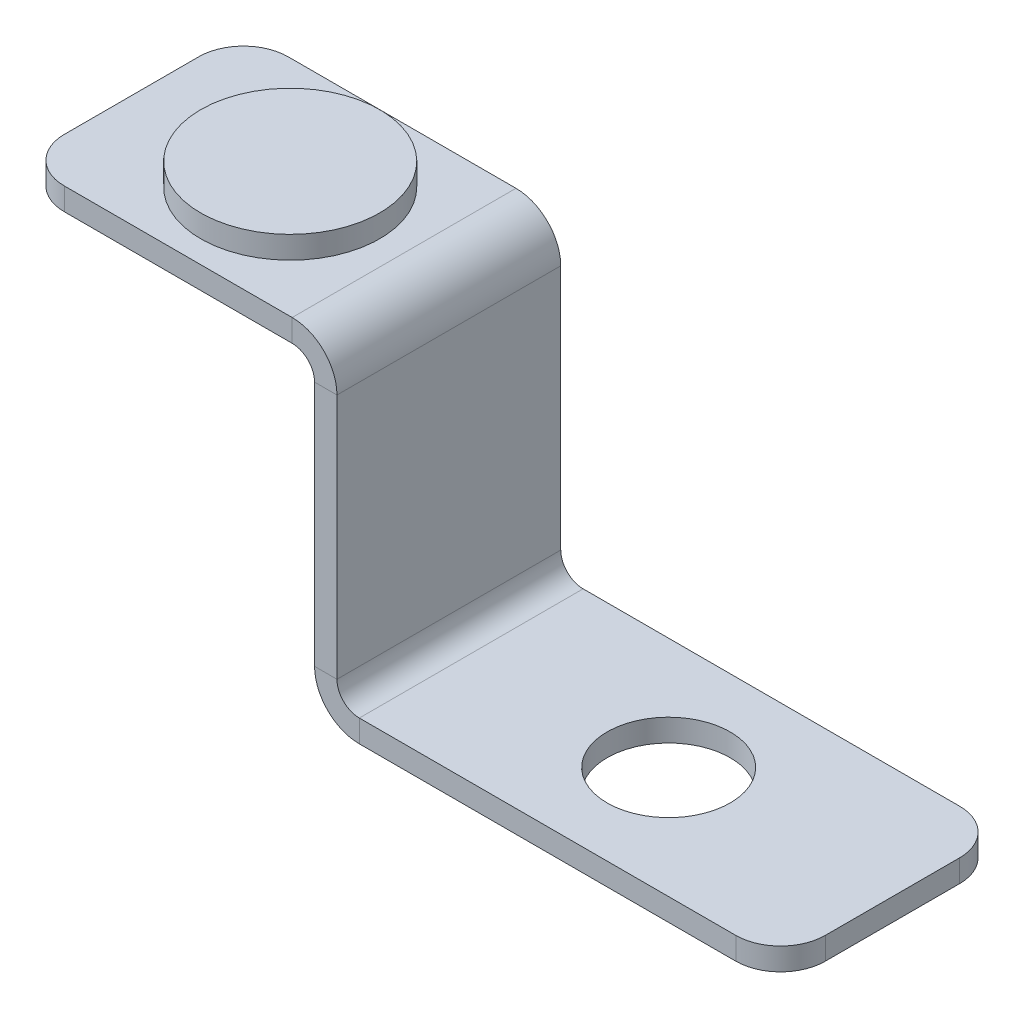
ISO-10303-21;
HEADER;
FILE_DESCRIPTION(('STEP AP214'),'2;1');
FILE_NAME('part.step','',(''),(''),'','','');
FILE_SCHEMA(('AUTOMOTIVE_DESIGN { 1 0 10303 214 1 1 1 1 }'));
ENDSEC;
DATA;
#1=APPLICATION_CONTEXT('core data for automotive mechanical design processes');
#2=APPLICATION_PROTOCOL_DEFINITION('international standard','automotive_design',2000,#1);
#3=PRODUCT_CONTEXT('',#1,'mechanical');
#4=PRODUCT('Part','Part','',(#3));
#5=PRODUCT_RELATED_PRODUCT_CATEGORY('part','',(#4));
#6=PRODUCT_DEFINITION_FORMATION('','',#4);
#7=PRODUCT_DEFINITION_CONTEXT('part definition',#1,'design');
#8=PRODUCT_DEFINITION('design','',#6,#7);
#9=PRODUCT_DEFINITION_SHAPE('','',#8);
#10=(LENGTH_UNIT() NAMED_UNIT(*) SI_UNIT(.MILLI.,.METRE.));
#11=(NAMED_UNIT(*) PLANE_ANGLE_UNIT() SI_UNIT($,.RADIAN.));
#12=(NAMED_UNIT(*) SI_UNIT($,.STERADIAN.) SOLID_ANGLE_UNIT());
#13=UNCERTAINTY_MEASURE_WITH_UNIT(LENGTH_MEASURE(1.E-05),#10,'distance_accuracy_value','');
#14=(GEOMETRIC_REPRESENTATION_CONTEXT(3) GLOBAL_UNCERTAINTY_ASSIGNED_CONTEXT((#13)) GLOBAL_UNIT_ASSIGNED_CONTEXT((#10,
#11,#12)) REPRESENTATION_CONTEXT('',''));
#15=CARTESIAN_POINT('',(0.,0.,0.));
#16=DIRECTION('',(0.,0.,1.));
#17=DIRECTION('',(1.,0.,0.));
#18=AXIS2_PLACEMENT_3D('',#15,#16,#17);
#19=CARTESIAN_POINT('',(7.08904862254812,15.,-5.));
#20=DIRECTION('',(0.,-1.,0.));
#21=DIRECTION('',(1.,0.,0.));
#22=AXIS2_PLACEMENT_3D('',#19,#20,#21);
#23=CYLINDRICAL_SURFACE('',#22,4.);
#24=CARTESIAN_POINT('',(7.08904862254812,15.,-5.));
#25=DIRECTION('',(0.,1.,0.));
#26=DIRECTION('',(-1.,0.,0.));
#27=AXIS2_PLACEMENT_3D('',#24,#25,#26);
#28=CIRCLE('',#27,4.);
#29=CARTESIAN_POINT('',(3.08904862254812,15.,-5.));
#30=VERTEX_POINT('',#29);
#31=EDGE_CURVE('E12',#30,#30,#28,.T.);
#32=ORIENTED_EDGE('',*,*,#31,.F.);
#33=EDGE_LOOP('',(#32));
#34=FACE_BOUND('',#33,.T.);
#35=CARTESIAN_POINT('',(7.08904862254812,14.,-5.));
#36=DIRECTION('',(0.,1.,0.));
#37=DIRECTION('',(-1.,0.,0.));
#38=AXIS2_PLACEMENT_3D('',#35,#36,#37);
#39=CIRCLE('',#38,4.);
#40=CARTESIAN_POINT('',(3.08904862254812,14.,-5.));
#41=VERTEX_POINT('',#40);
#42=EDGE_CURVE('E57',#41,#41,#39,.T.);
#43=ORIENTED_EDGE('',*,*,#42,.T.);
#44=EDGE_LOOP('',(#43));
#45=FACE_BOUND('',#44,.T.);
#46=ADVANCED_FACE('F54',(#34,#45),#23,.T.);
#47=CARTESIAN_POINT('',(7.08904862254812,15.,-5.));
#48=DIRECTION('',(0.,1.,0.));
#49=DIRECTION('',(-1.,0.,0.));
#50=AXIS2_PLACEMENT_3D('',#47,#48,#49);
#51=PLANE('',#50);
#52=ORIENTED_EDGE('',*,*,#31,.T.);
#53=EDGE_LOOP('',(#52));
#54=FACE_BOUND('',#53,.T.);
#55=ADVANCED_FACE('F69',(#54),#51,.T.);
#56=CARTESIAN_POINT('',(7.08904862254812,14.,-5.));
#57=DIRECTION('',(0.,1.,0.));
#58=DIRECTION('',(-1.,0.,0.));
#59=AXIS2_PLACEMENT_3D('',#56,#57,#58);
#60=PLANE('',#59);
#61=ORIENTED_EDGE('',*,*,#42,.F.);
#62=EDGE_LOOP('',(#61));
#63=FACE_BOUND('',#62,.T.);
#64=ADVANCED_FACE('F67',(#63),#60,.F.);
#65=CLOSED_SHELL('',(#46,#55,#64));
#66=MANIFOLD_SOLID_BREP('B2',#65);
#67=CARTESIAN_POINT('',(14.1780972450961,-18.1780972450962,-8.));
#68=DIRECTION('',(-1.,0.,0.));
#69=DIRECTION('',(0.,0.,-1.));
#70=AXIS2_PLACEMENT_3D('',#67,#68,#69);
#71=PLANE('',#70);
#72=DIRECTION('',(0.,1.,0.));
#73=VECTOR('',#72,1.);
#74=CARTESIAN_POINT('',(14.1780972450962,11.8219027549038,-10.));
#75=LINE('',#74,#73);
#76=CARTESIAN_POINT('',(14.1780972450962,1.,-10.));
#77=VERTEX_POINT('',#76);
#78=CARTESIAN_POINT('',(14.1780972450962,12.,-10.));
#79=VERTEX_POINT('',#78);
#80=EDGE_CURVE('E111',#77,#79,#75,.T.);
#81=ORIENTED_EDGE('',*,*,#80,.T.);
#82=DIRECTION('',(0.,0.,1.));
#83=VECTOR('',#82,1.);
#84=CARTESIAN_POINT('',(14.1780972450962,12.,-8.));
#85=LINE('',#84,#83);
#86=CARTESIAN_POINT('',(14.1780972450962,12.,0.));
#87=VERTEX_POINT('',#86);
#88=EDGE_CURVE('E103',#79,#87,#85,.T.);
#89=ORIENTED_EDGE('',*,*,#88,.T.);
#90=DIRECTION('',(0.,-1.,0.));
#91=VECTOR('',#90,1.);
#92=CARTESIAN_POINT('',(14.1780972450962,11.8219027549038,0.));
#93=LINE('',#92,#91);
#94=CARTESIAN_POINT('',(14.1780972450962,1.,0.));
#95=VERTEX_POINT('',#94);
#96=EDGE_CURVE('E119',#87,#95,#93,.T.);
#97=ORIENTED_EDGE('',*,*,#96,.T.);
#98=DIRECTION('',(0.,0.,1.));
#99=VECTOR('',#98,1.);
#100=CARTESIAN_POINT('',(14.1780972450962,1.,-8.));
#101=LINE('',#100,#99);
#102=EDGE_CURVE('E325',#77,#95,#101,.T.);
#103=ORIENTED_EDGE('',*,*,#102,.F.);
#104=EDGE_LOOP('',(#81,#89,#97,#103));
#105=FACE_BOUND('',#104,.T.);
#106=ADVANCED_FACE('F94',(#105),#71,.F.);
#107=CARTESIAN_POINT('',(13.1780972450961,-18.1780972450962,-8.));
#108=DIRECTION('',(-1.,0.,0.));
#109=DIRECTION('',(0.,0.,-1.));
#110=AXIS2_PLACEMENT_3D('',#107,#108,#109);
#111=PLANE('',#110);
#112=DIRECTION('',(0.,0.,1.));
#113=VECTOR('',#112,1.);
#114=CARTESIAN_POINT('',(13.1780972450962,12.,-8.));
#115=LINE('',#114,#113);
#116=CARTESIAN_POINT('',(13.1780972450962,12.,-10.));
#117=VERTEX_POINT('',#116);
#118=CARTESIAN_POINT('',(13.1780972450962,12.,0.));
#119=VERTEX_POINT('',#118);
#120=EDGE_CURVE('E329',#117,#119,#115,.T.);
#121=ORIENTED_EDGE('',*,*,#120,.F.);
#122=DIRECTION('',(0.,1.,0.));
#123=VECTOR('',#122,1.);
#124=CARTESIAN_POINT('',(13.1780972450962,11.8219027549038,-10.));
#125=LINE('',#124,#123);
#126=CARTESIAN_POINT('',(13.1780972450962,1.00000000000001,-10.));
#127=VERTEX_POINT('',#126);
#128=EDGE_CURVE('E336',#127,#117,#125,.T.);
#129=ORIENTED_EDGE('',*,*,#128,.F.);
#130=DIRECTION('',(0.,0.,1.));
#131=VECTOR('',#130,1.);
#132=CARTESIAN_POINT('',(13.1780972450962,1.00000000000001,-8.));
#133=LINE('',#132,#131);
#134=CARTESIAN_POINT('',(13.1780972450962,1.00000000000001,0.));
#135=VERTEX_POINT('',#134);
#136=EDGE_CURVE('E319',#127,#135,#133,.T.);
#137=ORIENTED_EDGE('',*,*,#136,.T.);
#138=DIRECTION('',(0.,-1.,0.));
#139=VECTOR('',#138,1.);
#140=CARTESIAN_POINT('',(13.1780972450962,11.8219027549038,0.));
#141=LINE('',#140,#139);
#142=EDGE_CURVE('E98',#119,#135,#141,.T.);
#143=ORIENTED_EDGE('',*,*,#142,.F.);
#144=EDGE_LOOP('',(#121,#129,#137,#143));
#145=FACE_BOUND('',#144,.T.);
#146=ADVANCED_FACE('F404',(#145),#111,.T.);
#147=CARTESIAN_POINT('',(13.1780972450962,11.8219027549038,-10.));
#148=DIRECTION('',(0.,0.,-1.));
#149=DIRECTION('',(0.,1.,0.));
#150=AXIS2_PLACEMENT_3D('',#147,#148,#149);
#151=PLANE('',#150);
#152=DIRECTION('',(-1.,0.,0.));
#153=VECTOR('',#152,1.);
#154=CARTESIAN_POINT('',(13.1780972450962,12.,-10.));
#155=LINE('',#154,#153);
#156=EDGE_CURVE('E52',#79,#117,#155,.T.);
#157=ORIENTED_EDGE('',*,*,#156,.F.);
#158=ORIENTED_EDGE('',*,*,#80,.F.);
#159=DIRECTION('',(-1.,0.,0.));
#160=VECTOR('',#159,1.);
#161=CARTESIAN_POINT('',(13.1780972450962,1.00000000000001,-10.));
#162=LINE('',#161,#160);
#163=EDGE_CURVE('E322',#77,#127,#162,.T.);
#164=ORIENTED_EDGE('',*,*,#163,.T.);
#165=ORIENTED_EDGE('',*,*,#128,.T.);
#166=EDGE_LOOP('',(#157,#158,#164,#165));
#167=FACE_BOUND('',#166,.T.);
#168=ADVANCED_FACE('F96',(#167),#151,.T.);
#169=CARTESIAN_POINT('',(13.1780972450962,11.8219027549038,0.));
#170=DIRECTION('',(0.,0.,1.));
#171=DIRECTION('',(0.,-1.,0.));
#172=AXIS2_PLACEMENT_3D('',#169,#170,#171);
#173=PLANE('',#172);
#174=DIRECTION('',(1.,0.,0.));
#175=VECTOR('',#174,1.);
#176=CARTESIAN_POINT('',(13.1780972450962,12.,0.));
#177=LINE('',#176,#175);
#178=EDGE_CURVE('E332',#119,#87,#177,.T.);
#179=ORIENTED_EDGE('',*,*,#178,.F.);
#180=ORIENTED_EDGE('',*,*,#142,.T.);
#181=DIRECTION('',(1.,0.,0.));
#182=VECTOR('',#181,1.);
#183=CARTESIAN_POINT('',(13.1780972450962,1.00000000000001,0.));
#184=LINE('',#183,#182);
#185=EDGE_CURVE('E327',#135,#95,#184,.T.);
#186=ORIENTED_EDGE('',*,*,#185,.T.);
#187=ORIENTED_EDGE('',*,*,#96,.F.);
#188=EDGE_LOOP('',(#179,#180,#186,#187));
#189=FACE_BOUND('',#188,.T.);
#190=ADVANCED_FACE('F341',(#189),#173,.T.);
#191=CARTESIAN_POINT('',(24.,-1.,-5.));
#192=DIRECTION('',(0.,1.,0.));
#193=DIRECTION('',(0.,0.,1.));
#194=AXIS2_PLACEMENT_3D('',#191,#192,#193);
#195=CYLINDRICAL_SURFACE('',#194,2.74999999999999);
#196=CARTESIAN_POINT('',(24.,-1.,-5.));
#197=DIRECTION('',(0.,1.,0.));
#198=DIRECTION('',(0.,0.,1.));
#199=AXIS2_PLACEMENT_3D('',#196,#197,#198);
#200=CIRCLE('',#199,2.74999999999999);
#201=CARTESIAN_POINT('',(24.,-1.,-2.25000000000001));
#202=VERTEX_POINT('',#201);
#203=EDGE_CURVE('E290',#202,#202,#200,.T.);
#204=ORIENTED_EDGE('',*,*,#203,.F.);
#205=EDGE_LOOP('',(#204));
#206=FACE_BOUND('',#205,.T.);
#207=CARTESIAN_POINT('',(24.,0.,-5.));
#208=DIRECTION('',(0.,1.,0.));
#209=DIRECTION('',(0.,0.,1.));
#210=AXIS2_PLACEMENT_3D('',#207,#208,#209);
#211=CIRCLE('',#210,2.74999999999999);
#212=CARTESIAN_POINT('',(24.,0.,-2.25000000000001));
#213=VERTEX_POINT('',#212);
#214=EDGE_CURVE('E308',#213,#213,#211,.T.);
#215=ORIENTED_EDGE('',*,*,#214,.T.);
#216=EDGE_LOOP('',(#215));
#217=FACE_BOUND('',#216,.T.);
#218=ADVANCED_FACE('F436',(#206,#217),#195,.F.);
#219=CARTESIAN_POINT('',(32.,-1.,-2.));
#220=DIRECTION('',(0.,1.,0.));
#221=DIRECTION('',(0.,0.,1.));
#222=AXIS2_PLACEMENT_3D('',#219,#220,#221);
#223=CYLINDRICAL_SURFACE('',#222,2.);
#224=CARTESIAN_POINT('',(32.,0.,-2.));
#225=DIRECTION('',(0.,1.,0.));
#226=DIRECTION('',(0.,0.,1.));
#227=AXIS2_PLACEMENT_3D('',#224,#225,#226);
#228=CIRCLE('',#227,2.);
#229=CARTESIAN_POINT('',(32.,0.,0.));
#230=VERTEX_POINT('',#229);
#231=CARTESIAN_POINT('',(34.,0.,-2.00000000000001));
#232=VERTEX_POINT('',#231);
#233=EDGE_CURVE('E278',#230,#232,#228,.T.);
#234=ORIENTED_EDGE('',*,*,#233,.F.);
#235=DIRECTION('',(0.,1.,0.));
#236=VECTOR('',#235,1.);
#237=CARTESIAN_POINT('',(32.,-1.,0.));
#238=LINE('',#237,#236);
#239=CARTESIAN_POINT('',(32.,-1.,0.));
#240=VERTEX_POINT('',#239);
#241=EDGE_CURVE('E267',#240,#230,#238,.T.);
#242=ORIENTED_EDGE('',*,*,#241,.F.);
#243=CARTESIAN_POINT('',(32.,-1.,-2.));
#244=DIRECTION('',(0.,1.,0.));
#245=DIRECTION('',(0.,0.,1.));
#246=AXIS2_PLACEMENT_3D('',#243,#244,#245);
#247=CIRCLE('',#246,2.);
#248=CARTESIAN_POINT('',(34.,-1.,-2.00000000000001));
#249=VERTEX_POINT('',#248);
#250=EDGE_CURVE('E305',#240,#249,#247,.T.);
#251=ORIENTED_EDGE('',*,*,#250,.T.);
#252=DIRECTION('',(0.,1.,0.));
#253=VECTOR('',#252,1.);
#254=CARTESIAN_POINT('',(34.,-1.,-2.00000000000001));
#255=LINE('',#254,#253);
#256=EDGE_CURVE('E303',#249,#232,#255,.T.);
#257=ORIENTED_EDGE('',*,*,#256,.T.);
#258=EDGE_LOOP('',(#234,#242,#251,#257));
#259=FACE_BOUND('',#258,.T.);
#260=ADVANCED_FACE('F434',(#259),#223,.T.);
#261=CARTESIAN_POINT('',(34.,-1.,-2.00000000000001));
#262=DIRECTION('',(1.,0.,0.));
#263=DIRECTION('',(0.,0.,-1.));
#264=AXIS2_PLACEMENT_3D('',#261,#262,#263);
#265=PLANE('',#264);
#266=DIRECTION('',(0.,0.,-1.));
#267=VECTOR('',#266,1.);
#268=CARTESIAN_POINT('',(34.,0.,-2.00000000000001));
#269=LINE('',#268,#267);
#270=CARTESIAN_POINT('',(34.,0.,-7.99999999999999));
#271=VERTEX_POINT('',#270);
#272=EDGE_CURVE('E275',#232,#271,#269,.T.);
#273=ORIENTED_EDGE('',*,*,#272,.F.);
#274=ORIENTED_EDGE('',*,*,#256,.F.);
#275=DIRECTION('',(0.,0.,-1.));
#276=VECTOR('',#275,1.);
#277=CARTESIAN_POINT('',(34.,-1.,-2.00000000000001));
#278=LINE('',#277,#276);
#279=CARTESIAN_POINT('',(34.,-1.,-7.99999999999999));
#280=VERTEX_POINT('',#279);
#281=EDGE_CURVE('E300',#249,#280,#278,.T.);
#282=ORIENTED_EDGE('',*,*,#281,.T.);
#283=DIRECTION('',(0.,1.,0.));
#284=VECTOR('',#283,1.);
#285=CARTESIAN_POINT('',(34.,-1.,-7.99999999999999));
#286=LINE('',#285,#284);
#287=EDGE_CURVE('E298',#280,#271,#286,.T.);
#288=ORIENTED_EDGE('',*,*,#287,.T.);
#289=EDGE_LOOP('',(#273,#274,#282,#288));
#290=FACE_BOUND('',#289,.T.);
#291=ADVANCED_FACE('F432',(#290),#265,.T.);
#292=CARTESIAN_POINT('',(32.,-1.,-8.));
#293=DIRECTION('',(0.,1.,0.));
#294=DIRECTION('',(0.,0.,1.));
#295=AXIS2_PLACEMENT_3D('',#292,#293,#294);
#296=CYLINDRICAL_SURFACE('',#295,2.);
#297=CARTESIAN_POINT('',(32.,0.,-8.));
#298=DIRECTION('',(0.,1.,0.));
#299=DIRECTION('',(0.,0.,-1.));
#300=AXIS2_PLACEMENT_3D('',#297,#298,#299);
#301=CIRCLE('',#300,2.);
#302=CARTESIAN_POINT('',(32.,0.,-10.));
#303=VERTEX_POINT('',#302);
#304=EDGE_CURVE('E272',#271,#303,#301,.T.);
#305=ORIENTED_EDGE('',*,*,#304,.F.);
#306=ORIENTED_EDGE('',*,*,#287,.F.);
#307=CARTESIAN_POINT('',(32.,-1.,-8.));
#308=DIRECTION('',(0.,1.,0.));
#309=DIRECTION('',(0.,0.,-1.));
#310=AXIS2_PLACEMENT_3D('',#307,#308,#309);
#311=CIRCLE('',#310,2.);
#312=CARTESIAN_POINT('',(32.,-1.,-10.));
#313=VERTEX_POINT('',#312);
#314=EDGE_CURVE('E295',#280,#313,#311,.T.);
#315=ORIENTED_EDGE('',*,*,#314,.T.);
#316=DIRECTION('',(0.,1.,0.));
#317=VECTOR('',#316,1.);
#318=CARTESIAN_POINT('',(32.,-1.,-10.));
#319=LINE('',#318,#317);
#320=EDGE_CURVE('E293',#313,#303,#319,.T.);
#321=ORIENTED_EDGE('',*,*,#320,.T.);
#322=EDGE_LOOP('',(#305,#306,#315,#321));
#323=FACE_BOUND('',#322,.T.);
#324=ADVANCED_FACE('F430',(#323),#296,.T.);
#325=CARTESIAN_POINT('',(32.,-1.,-8.));
#326=DIRECTION('',(0.,-1.,0.));
#327=DIRECTION('',(0.,0.,-1.));
#328=AXIS2_PLACEMENT_3D('',#325,#326,#327);
#329=PLANE('',#328);
#330=DIRECTION('',(0.,0.,1.));
#331=VECTOR('',#330,1.);
#332=CARTESIAN_POINT('',(15.1780972450962,-1.,-8.));
#333=LINE('',#332,#331);
#334=CARTESIAN_POINT('',(15.1780972450962,-1.,-10.));
#335=VERTEX_POINT('',#334);
#336=CARTESIAN_POINT('',(15.1780972450962,-1.,0.));
#337=VERTEX_POINT('',#336);
#338=EDGE_CURVE('E262',#335,#337,#333,.T.);
#339=ORIENTED_EDGE('',*,*,#338,.F.);
#340=DIRECTION('',(-1.,0.,0.));
#341=VECTOR('',#340,1.);
#342=CARTESIAN_POINT('',(2.00000000000001,-1.,-10.));
#343=LINE('',#342,#341);
#344=EDGE_CURVE('E288',#313,#335,#343,.T.);
#345=ORIENTED_EDGE('',*,*,#344,.F.);
#346=ORIENTED_EDGE('',*,*,#314,.F.);
#347=ORIENTED_EDGE('',*,*,#281,.F.);
#348=ORIENTED_EDGE('',*,*,#250,.F.);
#349=DIRECTION('',(1.,0.,0.));
#350=VECTOR('',#349,1.);
#351=CARTESIAN_POINT('',(2.00000000000001,-1.,0.));
#352=LINE('',#351,#350);
#353=EDGE_CURVE('E270',#337,#240,#352,.T.);
#354=ORIENTED_EDGE('',*,*,#353,.F.);
#355=EDGE_LOOP('',(#339,#345,#346,#347,#348,#354));
#356=FACE_BOUND('',#355,.T.);
#357=ORIENTED_EDGE('',*,*,#203,.T.);
#358=EDGE_LOOP('',(#357));
#359=FACE_BOUND('',#358,.T.);
#360=ADVANCED_FACE('F417',(#356,#359),#329,.T.);
#361=CARTESIAN_POINT('',(2.00000000000001,-1.,-10.));
#362=DIRECTION('',(0.,0.,-1.));
#363=DIRECTION('',(-1.,0.,0.));
#364=AXIS2_PLACEMENT_3D('',#361,#362,#363);
#365=PLANE('',#364);
#366=DIRECTION('',(0.,-1.,0.));
#367=VECTOR('',#366,1.);
#368=CARTESIAN_POINT('',(15.1780972450962,-1.,-10.));
#369=LINE('',#368,#367);
#370=CARTESIAN_POINT('',(15.1780972450962,0.,-10.));
#371=VERTEX_POINT('',#370);
#372=EDGE_CURVE('E311',#371,#335,#369,.T.);
#373=ORIENTED_EDGE('',*,*,#372,.F.);
#374=DIRECTION('',(-1.,0.,0.));
#375=VECTOR('',#374,1.);
#376=CARTESIAN_POINT('',(2.00000000000001,0.,-10.));
#377=LINE('',#376,#375);
#378=EDGE_CURVE('E286',#303,#371,#377,.T.);
#379=ORIENTED_EDGE('',*,*,#378,.F.);
#380=ORIENTED_EDGE('',*,*,#320,.F.);
#381=ORIENTED_EDGE('',*,*,#344,.T.);
#382=EDGE_LOOP('',(#373,#379,#380,#381));
#383=FACE_BOUND('',#382,.T.);
#384=ADVANCED_FACE('F412',(#383),#365,.T.);
#385=CARTESIAN_POINT('',(32.,0.,-8.));
#386=DIRECTION('',(0.,-1.,0.));
#387=DIRECTION('',(0.,0.,-1.));
#388=AXIS2_PLACEMENT_3D('',#385,#386,#387);
#389=PLANE('',#388);
#390=ORIENTED_EDGE('',*,*,#214,.F.);
#391=EDGE_LOOP('',(#390));
#392=FACE_BOUND('',#391,.T.);
#393=ORIENTED_EDGE('',*,*,#378,.T.);
#394=DIRECTION('',(0.,0.,1.));
#395=VECTOR('',#394,1.);
#396=CARTESIAN_POINT('',(15.1780972450962,0.,-8.));
#397=LINE('',#396,#395);
#398=CARTESIAN_POINT('',(15.1780972450962,0.,0.));
#399=VERTEX_POINT('',#398);
#400=EDGE_CURVE('E283',#371,#399,#397,.T.);
#401=ORIENTED_EDGE('',*,*,#400,.T.);
#402=DIRECTION('',(1.,0.,0.));
#403=VECTOR('',#402,1.);
#404=CARTESIAN_POINT('',(2.00000000000001,0.,0.));
#405=LINE('',#404,#403);
#406=EDGE_CURVE('E281',#399,#230,#405,.T.);
#407=ORIENTED_EDGE('',*,*,#406,.T.);
#408=ORIENTED_EDGE('',*,*,#233,.T.);
#409=ORIENTED_EDGE('',*,*,#272,.T.);
#410=ORIENTED_EDGE('',*,*,#304,.T.);
#411=EDGE_LOOP('',(#393,#401,#407,#408,#409,#410));
#412=FACE_BOUND('',#411,.T.);
#413=ADVANCED_FACE('F426',(#392,#412),#389,.F.);
#414=CARTESIAN_POINT('',(2.00000000000001,-1.,0.));
#415=DIRECTION('',(0.,0.,1.));
#416=DIRECTION('',(1.,0.,0.));
#417=AXIS2_PLACEMENT_3D('',#414,#415,#416);
#418=PLANE('',#417);
#419=DIRECTION('',(0.,1.,0.));
#420=VECTOR('',#419,1.);
#421=CARTESIAN_POINT('',(15.1780972450962,-1.,0.));
#422=LINE('',#421,#420);
#423=EDGE_CURVE('E314',#337,#399,#422,.T.);
#424=ORIENTED_EDGE('',*,*,#423,.F.);
#425=ORIENTED_EDGE('',*,*,#353,.T.);
#426=ORIENTED_EDGE('',*,*,#241,.T.);
#427=ORIENTED_EDGE('',*,*,#406,.F.);
#428=EDGE_LOOP('',(#424,#425,#426,#427));
#429=FACE_BOUND('',#428,.T.);
#430=ADVANCED_FACE('F423',(#429),#418,.T.);
#431=CARTESIAN_POINT('',(15.1780972450962,1.,-10.));
#432=DIRECTION('',(0.,0.,-1.));
#433=DIRECTION('',(-1.,0.,0.));
#434=AXIS2_PLACEMENT_3D('',#431,#432,#433);
#435=PLANE('',#434);
#436=ORIENTED_EDGE('',*,*,#163,.F.);
#437=CARTESIAN_POINT('',(15.1780972450962,1.,-10.));
#438=DIRECTION('',(0.,0.,-1.));
#439=DIRECTION('',(-1.,0.,0.));
#440=AXIS2_PLACEMENT_3D('',#437,#438,#439);
#441=CIRCLE('',#440,1.);
#442=EDGE_CURVE('E251',#77,#371,#441,.F.);
#443=ORIENTED_EDGE('',*,*,#442,.T.);
#444=ORIENTED_EDGE('',*,*,#372,.T.);
#445=CARTESIAN_POINT('',(15.1780972450962,1.,-10.));
#446=DIRECTION('',(0.,0.,1.));
#447=DIRECTION('',(-1.,0.,0.));
#448=AXIS2_PLACEMENT_3D('',#445,#446,#447);
#449=CIRCLE('',#448,2.);
#450=EDGE_CURVE('E256',#127,#335,#449,.T.);
#451=ORIENTED_EDGE('',*,*,#450,.F.);
#452=EDGE_LOOP('',(#436,#443,#444,#451));
#453=FACE_BOUND('',#452,.T.);
#454=ADVANCED_FACE('F408',(#453),#435,.T.);
#455=CARTESIAN_POINT('',(15.1780972450962,1.,0.));
#456=DIRECTION('',(0.,0.,1.));
#457=DIRECTION('',(1.,0.,0.));
#458=AXIS2_PLACEMENT_3D('',#455,#456,#457);
#459=PLANE('',#458);
#460=CARTESIAN_POINT('',(15.1780972450962,1.,0.));
#461=DIRECTION('',(0.,0.,-1.));
#462=DIRECTION('',(-1.,0.,0.));
#463=AXIS2_PLACEMENT_3D('',#460,#461,#462);
#464=CIRCLE('',#463,1.);
#465=EDGE_CURVE('E260',#399,#95,#464,.T.);
#466=ORIENTED_EDGE('',*,*,#465,.T.);
#467=ORIENTED_EDGE('',*,*,#185,.F.);
#468=CARTESIAN_POINT('',(15.1780972450962,1.,0.));
#469=DIRECTION('',(0.,0.,-1.));
#470=DIRECTION('',(1.,0.,0.));
#471=AXIS2_PLACEMENT_3D('',#468,#469,#470);
#472=CIRCLE('',#471,2.);
#473=EDGE_CURVE('E259',#337,#135,#472,.T.);
#474=ORIENTED_EDGE('',*,*,#473,.F.);
#475=ORIENTED_EDGE('',*,*,#423,.T.);
#476=EDGE_LOOP('',(#466,#467,#474,#475));
#477=FACE_BOUND('',#476,.T.);
#478=ADVANCED_FACE('F344',(#477),#459,.T.);
#479=CARTESIAN_POINT('',(15.1780972450962,1.,5.32238598753277));
#480=DIRECTION('',(0.,0.,-1.));
#481=DIRECTION('',(-1.,0.,0.));
#482=AXIS2_PLACEMENT_3D('',#479,#480,#481);
#483=CYLINDRICAL_SURFACE('',#482,2.);
#484=ORIENTED_EDGE('',*,*,#338,.T.);
#485=ORIENTED_EDGE('',*,*,#473,.T.);
#486=ORIENTED_EDGE('',*,*,#136,.F.);
#487=ORIENTED_EDGE('',*,*,#450,.T.);
#488=EDGE_LOOP('',(#484,#485,#486,#487));
#489=FACE_BOUND('',#488,.T.);
#490=ADVANCED_FACE('F407',(#489),#483,.T.);
#491=CARTESIAN_POINT('',(15.1780972450962,1.,5.32238598753277));
#492=DIRECTION('',(0.,0.,-1.));
#493=DIRECTION('',(-1.,0.,0.));
#494=AXIS2_PLACEMENT_3D('',#491,#492,#493);
#495=CYLINDRICAL_SURFACE('',#494,1.);
#496=ORIENTED_EDGE('',*,*,#400,.F.);
#497=ORIENTED_EDGE('',*,*,#442,.F.);
#498=ORIENTED_EDGE('',*,*,#102,.T.);
#499=ORIENTED_EDGE('',*,*,#465,.F.);
#500=EDGE_LOOP('',(#496,#497,#498,#499));
#501=FACE_BOUND('',#500,.T.);
#502=ADVANCED_FACE('F349',(#501),#495,.F.);
#503=CARTESIAN_POINT('',(12.1780972450962,12.,-10.));
#504=DIRECTION('',(0.,0.,1.));
#505=DIRECTION('',(1.,0.,0.));
#506=AXIS2_PLACEMENT_3D('',#503,#504,#505);
#507=PLANE('',#506);
#508=DIRECTION('',(0.,-1.,0.));
#509=VECTOR('',#508,1.);
#510=CARTESIAN_POINT('',(12.1780972450962,13.,-10.));
#511=LINE('',#510,#509);
#512=CARTESIAN_POINT('',(12.1780972450962,14.,-10.));
#513=VERTEX_POINT('',#512);
#514=CARTESIAN_POINT('',(12.1780972450962,13.,-10.));
#515=VERTEX_POINT('',#514);
#516=EDGE_CURVE('E218',#513,#515,#511,.T.);
#517=ORIENTED_EDGE('',*,*,#516,.F.);
#518=CARTESIAN_POINT('',(12.1780972450962,12.,-10.));
#519=DIRECTION('',(0.,0.,-1.));
#520=DIRECTION('',(-1.,0.,0.));
#521=AXIS2_PLACEMENT_3D('',#518,#519,#520);
#522=CIRCLE('',#521,2.);
#523=EDGE_CURVE('E229',#513,#79,#522,.T.);
#524=ORIENTED_EDGE('',*,*,#523,.T.);
#525=ORIENTED_EDGE('',*,*,#156,.T.);
#526=CARTESIAN_POINT('',(12.1780972450962,12.,-10.));
#527=DIRECTION('',(0.,0.,-1.));
#528=DIRECTION('',(1.,0.,0.));
#529=AXIS2_PLACEMENT_3D('',#526,#527,#528);
#530=CIRCLE('',#529,0.999999999999998);
#531=EDGE_CURVE('E244',#515,#117,#530,.T.);
#532=ORIENTED_EDGE('',*,*,#531,.F.);
#533=EDGE_LOOP('',(#517,#524,#525,#532));
#534=FACE_BOUND('',#533,.T.);
#535=ADVANCED_FACE('F361',(#534),#507,.F.);
#536=CARTESIAN_POINT('',(12.1780972450962,12.,0.));
#537=DIRECTION('',(0.,0.,-1.));
#538=DIRECTION('',(-1.,0.,0.));
#539=AXIS2_PLACEMENT_3D('',#536,#537,#538);
#540=PLANE('',#539);
#541=CARTESIAN_POINT('',(12.1780972450962,12.,0.));
#542=DIRECTION('',(0.,0.,-1.));
#543=DIRECTION('',(-1.,0.,0.));
#544=AXIS2_PLACEMENT_3D('',#541,#542,#543);
#545=CIRCLE('',#544,2.);
#546=CARTESIAN_POINT('',(12.1780972450962,14.,0.));
#547=VERTEX_POINT('',#546);
#548=EDGE_CURVE('E248',#87,#547,#545,.F.);
#549=ORIENTED_EDGE('',*,*,#548,.T.);
#550=DIRECTION('',(0.,1.,0.));
#551=VECTOR('',#550,1.);
#552=CARTESIAN_POINT('',(12.1780972450962,13.,0.));
#553=LINE('',#552,#551);
#554=CARTESIAN_POINT('',(12.1780972450962,13.,0.));
#555=VERTEX_POINT('',#554);
#556=EDGE_CURVE('E375',#555,#547,#553,.T.);
#557=ORIENTED_EDGE('',*,*,#556,.F.);
#558=CARTESIAN_POINT('',(12.1780972450962,12.,0.));
#559=DIRECTION('',(0.,0.,1.));
#560=DIRECTION('',(-1.,0.,0.));
#561=AXIS2_PLACEMENT_3D('',#558,#559,#560);
#562=CIRCLE('',#561,0.999999999999998);
#563=EDGE_CURVE('E247',#119,#555,#562,.T.);
#564=ORIENTED_EDGE('',*,*,#563,.F.);
#565=ORIENTED_EDGE('',*,*,#178,.T.);
#566=EDGE_LOOP('',(#549,#557,#564,#565));
#567=FACE_BOUND('',#566,.T.);
#568=ADVANCED_FACE('F399',(#567),#540,.F.);
#569=CARTESIAN_POINT('',(12.1780972450962,12.,5.32238598753277));
#570=DIRECTION('',(0.,0.,-1.));
#571=DIRECTION('',(-1.,0.,0.));
#572=AXIS2_PLACEMENT_3D('',#569,#570,#571);
#573=CYLINDRICAL_SURFACE('',#572,1.);
#574=ORIENTED_EDGE('',*,*,#120,.T.);
#575=ORIENTED_EDGE('',*,*,#563,.T.);
#576=DIRECTION('',(0.,0.,1.));
#577=VECTOR('',#576,1.);
#578=CARTESIAN_POINT('',(12.1780972450962,13.,-8.));
#579=LINE('',#578,#577);
#580=EDGE_CURVE('E381',#515,#555,#579,.T.);
#581=ORIENTED_EDGE('',*,*,#580,.F.);
#582=ORIENTED_EDGE('',*,*,#531,.T.);
#583=EDGE_LOOP('',(#574,#575,#581,#582));
#584=FACE_BOUND('',#583,.T.);
#585=ADVANCED_FACE('F402',(#584),#573,.F.);
#586=CARTESIAN_POINT('',(12.1780972450962,12.,5.32238598753277));
#587=DIRECTION('',(0.,0.,-1.));
#588=DIRECTION('',(-1.,0.,0.));
#589=AXIS2_PLACEMENT_3D('',#586,#587,#588);
#590=CYLINDRICAL_SURFACE('',#589,2.);
#591=ORIENTED_EDGE('',*,*,#88,.F.);
#592=ORIENTED_EDGE('',*,*,#523,.F.);
#593=DIRECTION('',(0.,0.,1.));
#594=VECTOR('',#593,1.);
#595=CARTESIAN_POINT('',(12.1780972450962,14.,-8.));
#596=LINE('',#595,#594);
#597=EDGE_CURVE('E237',#513,#547,#596,.T.);
#598=ORIENTED_EDGE('',*,*,#597,.T.);
#599=ORIENTED_EDGE('',*,*,#548,.F.);
#600=EDGE_LOOP('',(#591,#592,#598,#599));
#601=FACE_BOUND('',#600,.T.);
#602=ADVANCED_FACE('F360',(#601),#590,.T.);
#603=CARTESIAN_POINT('',(2.00000000000005,13.,-8.));
#604=DIRECTION('',(0.,1.,0.));
#605=DIRECTION('',(0.,0.,1.));
#606=AXIS2_PLACEMENT_3D('',#603,#604,#605);
#607=CYLINDRICAL_SURFACE('',#606,2.);
#608=CARTESIAN_POINT('',(2.00000000000004,14.,-8.));
#609=DIRECTION('',(0.,1.,0.));
#610=DIRECTION('',(0.,0.,-1.));
#611=AXIS2_PLACEMENT_3D('',#608,#609,#610);
#612=CIRCLE('',#611,2.);
#613=CARTESIAN_POINT('',(2.00000000000005,14.,-10.));
#614=VERTEX_POINT('',#613);
#615=CARTESIAN_POINT('',(0.,14.,-7.99999999999999));
#616=VERTEX_POINT('',#615);
#617=EDGE_CURVE('E228',#614,#616,#612,.T.);
#618=ORIENTED_EDGE('',*,*,#617,.F.);
#619=DIRECTION('',(0.,1.,0.));
#620=VECTOR('',#619,1.);
#621=CARTESIAN_POINT('',(2.00000000000006,13.,-10.));
#622=LINE('',#621,#620);
#623=CARTESIAN_POINT('',(2.00000000000006,13.,-10.));
#624=VERTEX_POINT('',#623);
#625=EDGE_CURVE('E215',#624,#614,#622,.T.);
#626=ORIENTED_EDGE('',*,*,#625,.F.);
#627=CARTESIAN_POINT('',(2.00000000000005,13.,-8.));
#628=DIRECTION('',(0.,1.,0.));
#629=DIRECTION('',(0.,0.,-1.));
#630=AXIS2_PLACEMENT_3D('',#627,#628,#629);
#631=CIRCLE('',#630,2.);
#632=CARTESIAN_POINT('',(0.,13.,-7.99999999999999));
#633=VERTEX_POINT('',#632);
#634=EDGE_CURVE('E226',#624,#633,#631,.T.);
#635=ORIENTED_EDGE('',*,*,#634,.T.);
#636=DIRECTION('',(0.,1.,0.));
#637=VECTOR('',#636,1.);
#638=CARTESIAN_POINT('',(0.,13.,-7.99999999999999));
#639=LINE('',#638,#637);
#640=EDGE_CURVE('E236',#633,#616,#639,.T.);
#641=ORIENTED_EDGE('',*,*,#640,.T.);
#642=EDGE_LOOP('',(#618,#626,#635,#641));
#643=FACE_BOUND('',#642,.T.);
#644=ADVANCED_FACE('F225',(#643),#607,.T.);
#645=CARTESIAN_POINT('',(0.,13.,-2.00000000000001));
#646=DIRECTION('',(-1.,0.,0.));
#647=DIRECTION('',(0.,0.,1.));
#648=AXIS2_PLACEMENT_3D('',#645,#646,#647);
#649=PLANE('',#648);
#650=DIRECTION('',(0.,0.,1.));
#651=VECTOR('',#650,1.);
#652=CARTESIAN_POINT('',(0.,14.,-2.00000000000001));
#653=LINE('',#652,#651);
#654=CARTESIAN_POINT('',(0.,14.,-2.00000000000001));
#655=VERTEX_POINT('',#654);
#656=EDGE_CURVE('E369',#616,#655,#653,.T.);
#657=ORIENTED_EDGE('',*,*,#656,.F.);
#658=ORIENTED_EDGE('',*,*,#640,.F.);
#659=DIRECTION('',(0.,0.,1.));
#660=VECTOR('',#659,1.);
#661=CARTESIAN_POINT('',(0.,13.,-2.00000000000001));
#662=LINE('',#661,#660);
#663=CARTESIAN_POINT('',(0.,13.,-2.00000000000001));
#664=VERTEX_POINT('',#663);
#665=EDGE_CURVE('E235',#633,#664,#662,.T.);
#666=ORIENTED_EDGE('',*,*,#665,.T.);
#667=DIRECTION('',(0.,1.,0.));
#668=VECTOR('',#667,1.);
#669=CARTESIAN_POINT('',(0.,13.,-2.00000000000001));
#670=LINE('',#669,#668);
#671=EDGE_CURVE('E389',#664,#655,#670,.T.);
#672=ORIENTED_EDGE('',*,*,#671,.T.);
#673=EDGE_LOOP('',(#657,#658,#666,#672));
#674=FACE_BOUND('',#673,.T.);
#675=ADVANCED_FACE('F392',(#674),#649,.T.);
#676=CARTESIAN_POINT('',(2.00000000000004,13.,-2.));
#677=DIRECTION('',(0.,1.,0.));
#678=DIRECTION('',(0.,0.,1.));
#679=AXIS2_PLACEMENT_3D('',#676,#677,#678);
#680=CYLINDRICAL_SURFACE('',#679,2.);
#681=CARTESIAN_POINT('',(2.00000000000004,14.,-2.));
#682=DIRECTION('',(0.,1.,0.));
#683=DIRECTION('',(0.,0.,-1.));
#684=AXIS2_PLACEMENT_3D('',#681,#682,#683);
#685=CIRCLE('',#684,2.);
#686=CARTESIAN_POINT('',(2.00000000000006,14.,0.));
#687=VERTEX_POINT('',#686);
#688=EDGE_CURVE('E364',#655,#687,#685,.T.);
#689=ORIENTED_EDGE('',*,*,#688,.F.);
#690=ORIENTED_EDGE('',*,*,#671,.F.);
#691=CARTESIAN_POINT('',(2.00000000000004,13.,-2.));
#692=DIRECTION('',(0.,1.,0.));
#693=DIRECTION('',(0.,0.,-1.));
#694=AXIS2_PLACEMENT_3D('',#691,#692,#693);
#695=CIRCLE('',#694,2.);
#696=CARTESIAN_POINT('',(2.00000000000006,13.,0.));
#697=VERTEX_POINT('',#696);
#698=EDGE_CURVE('E386',#664,#697,#695,.T.);
#699=ORIENTED_EDGE('',*,*,#698,.T.);
#700=DIRECTION('',(0.,1.,0.));
#701=VECTOR('',#700,1.);
#702=CARTESIAN_POINT('',(2.00000000000006,13.,0.));
#703=LINE('',#702,#701);
#704=EDGE_CURVE('E383',#697,#687,#703,.T.);
#705=ORIENTED_EDGE('',*,*,#704,.T.);
#706=EDGE_LOOP('',(#689,#690,#699,#705));
#707=FACE_BOUND('',#706,.T.);
#708=ADVANCED_FACE('F543',(#707),#680,.T.);
#709=CARTESIAN_POINT('',(44.7123889803847,13.,-8.));
#710=DIRECTION('',(0.,-1.,0.));
#711=DIRECTION('',(0.,0.,-1.));
#712=AXIS2_PLACEMENT_3D('',#709,#710,#711);
#713=PLANE('',#712);
#714=DIRECTION('',(-1.,0.,0.));
#715=VECTOR('',#714,1.);
#716=CARTESIAN_POINT('',(14.7123889803848,13.,-10.));
#717=LINE('',#716,#715);
#718=EDGE_CURVE('E212',#515,#624,#717,.T.);
#719=ORIENTED_EDGE('',*,*,#718,.F.);
#720=ORIENTED_EDGE('',*,*,#580,.T.);
#721=DIRECTION('',(1.,0.,0.));
#722=VECTOR('',#721,1.);
#723=CARTESIAN_POINT('',(14.7123889803848,13.,0.));
#724=LINE('',#723,#722);
#725=EDGE_CURVE('E378',#697,#555,#724,.T.);
#726=ORIENTED_EDGE('',*,*,#725,.F.);
#727=ORIENTED_EDGE('',*,*,#698,.F.);
#728=ORIENTED_EDGE('',*,*,#665,.F.);
#729=ORIENTED_EDGE('',*,*,#634,.F.);
#730=EDGE_LOOP('',(#719,#720,#726,#727,#728,#729));
#731=FACE_BOUND('',#730,.T.);
#732=ADVANCED_FACE('F232',(#731),#713,.T.);
#733=CARTESIAN_POINT('',(14.7123889803848,13.,0.));
#734=DIRECTION('',(0.,0.,1.));
#735=DIRECTION('',(1.,0.,0.));
#736=AXIS2_PLACEMENT_3D('',#733,#734,#735);
#737=PLANE('',#736);
#738=ORIENTED_EDGE('',*,*,#725,.T.);
#739=ORIENTED_EDGE('',*,*,#556,.T.);
#740=DIRECTION('',(1.,0.,0.));
#741=VECTOR('',#740,1.);
#742=CARTESIAN_POINT('',(14.7123889803848,14.,0.));
#743=LINE('',#742,#741);
#744=EDGE_CURVE('E362',#687,#547,#743,.T.);
#745=ORIENTED_EDGE('',*,*,#744,.F.);
#746=ORIENTED_EDGE('',*,*,#704,.F.);
#747=EDGE_LOOP('',(#738,#739,#745,#746));
#748=FACE_BOUND('',#747,.T.);
#749=ADVANCED_FACE('F557',(#748),#737,.T.);
#750=CARTESIAN_POINT('',(44.7123889803847,14.,-8.));
#751=DIRECTION('',(0.,-1.,0.));
#752=DIRECTION('',(0.,0.,-1.));
#753=AXIS2_PLACEMENT_3D('',#750,#751,#752);
#754=PLANE('',#753);
#755=ORIENTED_EDGE('',*,*,#597,.F.);
#756=DIRECTION('',(-1.,0.,0.));
#757=VECTOR('',#756,1.);
#758=CARTESIAN_POINT('',(14.7123889803848,14.,-10.));
#759=LINE('',#758,#757);
#760=EDGE_CURVE('E373',#513,#614,#759,.T.);
#761=ORIENTED_EDGE('',*,*,#760,.T.);
#762=ORIENTED_EDGE('',*,*,#617,.T.);
#763=ORIENTED_EDGE('',*,*,#656,.T.);
#764=ORIENTED_EDGE('',*,*,#688,.T.);
#765=ORIENTED_EDGE('',*,*,#744,.T.);
#766=EDGE_LOOP('',(#755,#761,#762,#763,#764,#765));
#767=FACE_BOUND('',#766,.T.);
#768=ADVANCED_FACE('F396',(#767),#754,.F.);
#769=CARTESIAN_POINT('',(14.7123889803848,13.,-10.));
#770=DIRECTION('',(0.,0.,-1.));
#771=DIRECTION('',(-1.,0.,0.));
#772=AXIS2_PLACEMENT_3D('',#769,#770,#771);
#773=PLANE('',#772);
#774=ORIENTED_EDGE('',*,*,#760,.F.);
#775=ORIENTED_EDGE('',*,*,#516,.T.);
#776=ORIENTED_EDGE('',*,*,#718,.T.);
#777=ORIENTED_EDGE('',*,*,#625,.T.);
#778=EDGE_LOOP('',(#774,#775,#776,#777));
#779=FACE_BOUND('',#778,.T.);
#780=ADVANCED_FACE('F214',(#779),#773,.T.);
#781=CLOSED_SHELL('',(#106,#146,#168,#190,#218,#260,#291,#324,#360,#384,#413,#430,#454,#478,
#490,#502,#535,#568,#585,#602,#644,#675,#708,#732,#749,#768,#780));
#782=MANIFOLD_SOLID_BREP('B7',#781);
#783=ADVANCED_BREP_SHAPE_REPRESENTATION('',(#18,#66,#782),#14);
#784=SHAPE_DEFINITION_REPRESENTATION(#9,#783);
ENDSEC;
END-ISO-10303-21;
